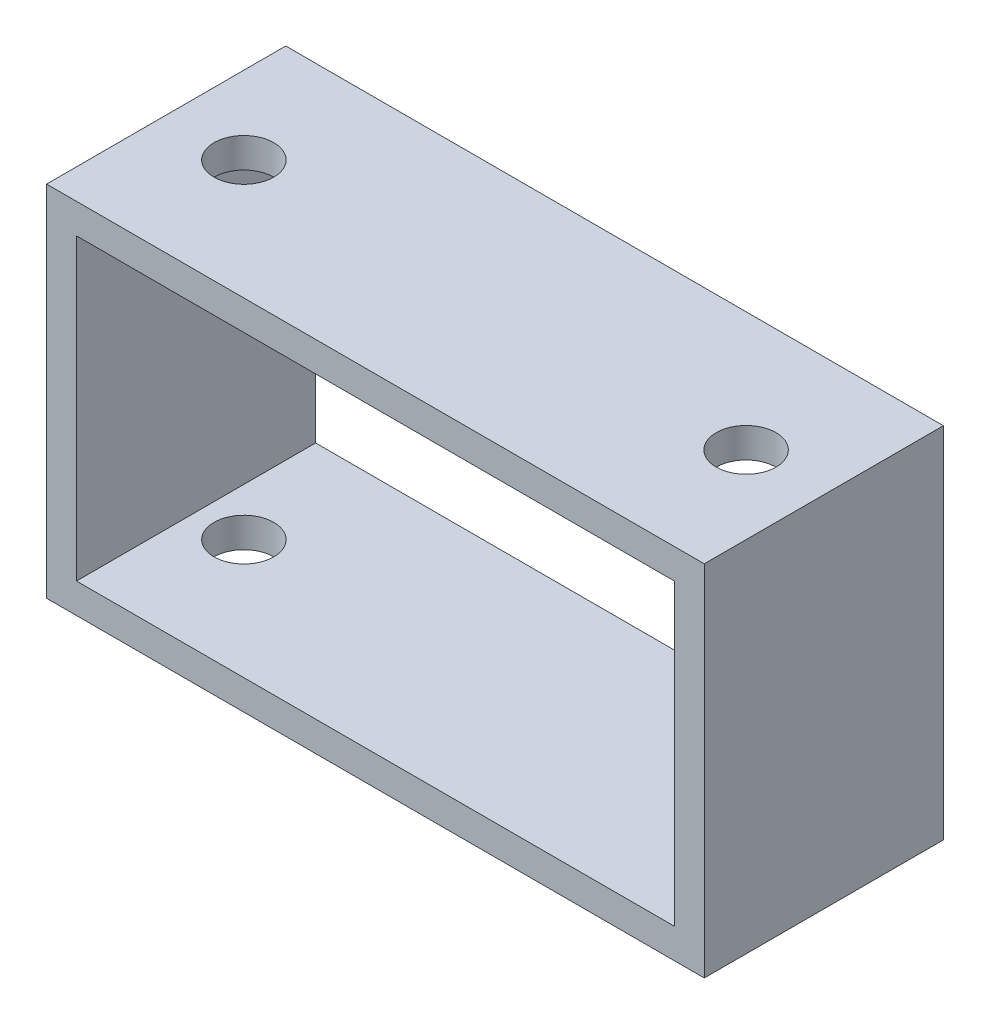
ISO-10303-21;
HEADER;
FILE_DESCRIPTION(('STEP AP214'),'2;1');
FILE_NAME('part.step','',(''),(''),'','','');
FILE_SCHEMA(('AUTOMOTIVE_DESIGN { 1 0 10303 214 1 1 1 1 }'));
ENDSEC;
DATA;
#1=APPLICATION_CONTEXT('core data for automotive mechanical design processes');
#2=APPLICATION_PROTOCOL_DEFINITION('international standard','automotive_design',2000,#1);
#3=PRODUCT_CONTEXT('',#1,'mechanical');
#4=PRODUCT('Part','Part','',(#3));
#5=PRODUCT_RELATED_PRODUCT_CATEGORY('part','',(#4));
#6=PRODUCT_DEFINITION_FORMATION('','',#4);
#7=PRODUCT_DEFINITION_CONTEXT('part definition',#1,'design');
#8=PRODUCT_DEFINITION('design','',#6,#7);
#9=PRODUCT_DEFINITION_SHAPE('','',#8);
#10=(LENGTH_UNIT() NAMED_UNIT(*) SI_UNIT(.MILLI.,.METRE.));
#11=(NAMED_UNIT(*) PLANE_ANGLE_UNIT() SI_UNIT($,.RADIAN.));
#12=(NAMED_UNIT(*) SI_UNIT($,.STERADIAN.) SOLID_ANGLE_UNIT());
#13=UNCERTAINTY_MEASURE_WITH_UNIT(LENGTH_MEASURE(1.E-05),#10,'distance_accuracy_value','');
#14=(GEOMETRIC_REPRESENTATION_CONTEXT(3) GLOBAL_UNCERTAINTY_ASSIGNED_CONTEXT((#13)) GLOBAL_UNIT_ASSIGNED_CONTEXT((#10,
#11,#12)) REPRESENTATION_CONTEXT('',''));
#15=CARTESIAN_POINT('',(0.,0.,0.));
#16=DIRECTION('',(0.,0.,1.));
#17=DIRECTION('',(1.,0.,0.));
#18=AXIS2_PLACEMENT_3D('',#15,#16,#17);
#19=CARTESIAN_POINT('',(27.5,30.,10.));
#20=DIRECTION('',(-1.,0.,0.));
#21=DIRECTION('',(0.,0.,1.));
#22=AXIS2_PLACEMENT_3D('',#19,#20,#21);
#23=PLANE('',#22);
#24=DIRECTION('',(0.,0.,-1.));
#25=VECTOR('',#24,1.);
#26=CARTESIAN_POINT('',(27.5,0.,10.));
#27=LINE('',#26,#25);
#28=CARTESIAN_POINT('',(27.5,0.,10.));
#29=VERTEX_POINT('',#28);
#30=CARTESIAN_POINT('',(27.5,0.,-10.));
#31=VERTEX_POINT('',#30);
#32=EDGE_CURVE('E119',#29,#31,#27,.T.);
#33=ORIENTED_EDGE('',*,*,#32,.T.);
#34=DIRECTION('',(0.,-1.,0.));
#35=VECTOR('',#34,1.);
#36=CARTESIAN_POINT('',(27.5,30.,-10.));
#37=LINE('',#36,#35);
#38=CARTESIAN_POINT('',(27.5,30.,-10.));
#39=VERTEX_POINT('',#38);
#40=EDGE_CURVE('E11',#39,#31,#37,.T.);
#41=ORIENTED_EDGE('',*,*,#40,.F.);
#42=DIRECTION('',(0.,0.,-1.));
#43=VECTOR('',#42,1.);
#44=CARTESIAN_POINT('',(27.5,30.,10.));
#45=LINE('',#44,#43);
#46=CARTESIAN_POINT('',(27.5,30.,10.));
#47=VERTEX_POINT('',#46);
#48=EDGE_CURVE('E142',#47,#39,#45,.T.);
#49=ORIENTED_EDGE('',*,*,#48,.F.);
#50=DIRECTION('',(0.,-1.,0.));
#51=VECTOR('',#50,1.);
#52=CARTESIAN_POINT('',(27.5,30.,10.));
#53=LINE('',#52,#51);
#54=EDGE_CURVE('E152',#47,#29,#53,.T.);
#55=ORIENTED_EDGE('',*,*,#54,.T.);
#56=EDGE_LOOP('',(#33,#41,#49,#55));
#57=FACE_BOUND('',#56,.T.);
#58=ADVANCED_FACE('F39',(#57),#23,.F.);
#59=CARTESIAN_POINT('',(-27.5,30.,-10.));
#60=DIRECTION('',(0.,0.,1.));
#61=DIRECTION('',(1.,0.,0.));
#62=AXIS2_PLACEMENT_3D('',#59,#60,#61);
#63=PLANE('',#62);
#64=DIRECTION('',(-1.,0.,0.));
#65=VECTOR('',#64,1.);
#66=CARTESIAN_POINT('',(-25.,2.5,-10.));
#67=LINE('',#66,#65);
#68=CARTESIAN_POINT('',(25.,2.5,-10.));
#69=VERTEX_POINT('',#68);
#70=CARTESIAN_POINT('',(-25.,2.5,-10.));
#71=VERTEX_POINT('',#70);
#72=EDGE_CURVE('E125',#69,#71,#67,.T.);
#73=ORIENTED_EDGE('',*,*,#72,.F.);
#74=DIRECTION('',(0.,-1.,0.));
#75=VECTOR('',#74,1.);
#76=CARTESIAN_POINT('',(25.,2.5,-10.));
#77=LINE('',#76,#75);
#78=CARTESIAN_POINT('',(25.,27.5,-10.));
#79=VERTEX_POINT('',#78);
#80=EDGE_CURVE('E107',#79,#69,#77,.T.);
#81=ORIENTED_EDGE('',*,*,#80,.F.);
#82=DIRECTION('',(1.,0.,0.));
#83=VECTOR('',#82,1.);
#84=CARTESIAN_POINT('',(-25.,27.5,-10.));
#85=LINE('',#84,#83);
#86=CARTESIAN_POINT('',(-25.,27.5,-10.));
#87=VERTEX_POINT('',#86);
#88=EDGE_CURVE('E116',#87,#79,#85,.T.);
#89=ORIENTED_EDGE('',*,*,#88,.F.);
#90=DIRECTION('',(0.,1.,0.));
#91=VECTOR('',#90,1.);
#92=CARTESIAN_POINT('',(-25.,2.5,-10.));
#93=LINE('',#92,#91);
#94=EDGE_CURVE('E55',#71,#87,#93,.T.);
#95=ORIENTED_EDGE('',*,*,#94,.F.);
#96=EDGE_LOOP('',(#73,#81,#89,#95));
#97=FACE_BOUND('',#96,.T.);
#98=DIRECTION('',(-1.,0.,0.));
#99=VECTOR('',#98,1.);
#100=CARTESIAN_POINT('',(-27.5,0.,-10.));
#101=LINE('',#100,#99);
#102=CARTESIAN_POINT('',(-27.5,0.,-10.));
#103=VERTEX_POINT('',#102);
#104=EDGE_CURVE('E155',#31,#103,#101,.T.);
#105=ORIENTED_EDGE('',*,*,#104,.T.);
#106=DIRECTION('',(0.,-1.,0.));
#107=VECTOR('',#106,1.);
#108=CARTESIAN_POINT('',(-27.5,30.,-10.));
#109=LINE('',#108,#107);
#110=CARTESIAN_POINT('',(-27.5,30.,-10.));
#111=VERTEX_POINT('',#110);
#112=EDGE_CURVE('E47',#111,#103,#109,.T.);
#113=ORIENTED_EDGE('',*,*,#112,.F.);
#114=DIRECTION('',(-1.,0.,0.));
#115=VECTOR('',#114,1.);
#116=CARTESIAN_POINT('',(-27.5,30.,-10.));
#117=LINE('',#116,#115);
#118=EDGE_CURVE('E145',#39,#111,#117,.T.);
#119=ORIENTED_EDGE('',*,*,#118,.F.);
#120=ORIENTED_EDGE('',*,*,#40,.T.);
#121=EDGE_LOOP('',(#105,#113,#119,#120));
#122=FACE_BOUND('',#121,.T.);
#123=ADVANCED_FACE('F122',(#97,#122),#63,.F.);
#124=CARTESIAN_POINT('',(-27.5,30.,10.));
#125=DIRECTION('',(1.,0.,0.));
#126=DIRECTION('',(0.,0.,-1.));
#127=AXIS2_PLACEMENT_3D('',#124,#125,#126);
#128=PLANE('',#127);
#129=DIRECTION('',(0.,0.,1.));
#130=VECTOR('',#129,1.);
#131=CARTESIAN_POINT('',(-27.5,0.,10.));
#132=LINE('',#131,#130);
#133=CARTESIAN_POINT('',(-27.5,0.,10.));
#134=VERTEX_POINT('',#133);
#135=EDGE_CURVE('E157',#103,#134,#132,.T.);
#136=ORIENTED_EDGE('',*,*,#135,.T.);
#137=DIRECTION('',(0.,-1.,0.));
#138=VECTOR('',#137,1.);
#139=CARTESIAN_POINT('',(-27.5,30.,10.));
#140=LINE('',#139,#138);
#141=CARTESIAN_POINT('',(-27.5,30.,10.));
#142=VERTEX_POINT('',#141);
#143=EDGE_CURVE('E162',#142,#134,#140,.T.);
#144=ORIENTED_EDGE('',*,*,#143,.F.);
#145=DIRECTION('',(0.,0.,1.));
#146=VECTOR('',#145,1.);
#147=CARTESIAN_POINT('',(-27.5,30.,10.));
#148=LINE('',#147,#146);
#149=EDGE_CURVE('E148',#111,#142,#148,.T.);
#150=ORIENTED_EDGE('',*,*,#149,.F.);
#151=ORIENTED_EDGE('',*,*,#112,.T.);
#152=EDGE_LOOP('',(#136,#144,#150,#151));
#153=FACE_BOUND('',#152,.T.);
#154=ADVANCED_FACE('F217',(#153),#128,.F.);
#155=CARTESIAN_POINT('',(-27.5,30.,10.));
#156=DIRECTION('',(0.,0.,-1.));
#157=DIRECTION('',(-1.,0.,0.));
#158=AXIS2_PLACEMENT_3D('',#155,#156,#157);
#159=PLANE('',#158);
#160=DIRECTION('',(-1.,0.,0.));
#161=VECTOR('',#160,1.);
#162=CARTESIAN_POINT('',(-25.,27.5,10.));
#163=LINE('',#162,#161);
#164=CARTESIAN_POINT('',(25.,27.5,10.));
#165=VERTEX_POINT('',#164);
#166=CARTESIAN_POINT('',(-25.,27.5,10.));
#167=VERTEX_POINT('',#166);
#168=EDGE_CURVE('E127',#165,#167,#163,.T.);
#169=ORIENTED_EDGE('',*,*,#168,.F.);
#170=DIRECTION('',(0.,1.,0.));
#171=VECTOR('',#170,1.);
#172=CARTESIAN_POINT('',(25.,2.5,10.));
#173=LINE('',#172,#171);
#174=CARTESIAN_POINT('',(25.,2.5,10.));
#175=VERTEX_POINT('',#174);
#176=EDGE_CURVE('E63',#175,#165,#173,.T.);
#177=ORIENTED_EDGE('',*,*,#176,.F.);
#178=DIRECTION('',(1.,0.,0.));
#179=VECTOR('',#178,1.);
#180=CARTESIAN_POINT('',(-25.,2.5,10.));
#181=LINE('',#180,#179);
#182=CARTESIAN_POINT('',(-25.,2.5,10.));
#183=VERTEX_POINT('',#182);
#184=EDGE_CURVE('E113',#183,#175,#181,.T.);
#185=ORIENTED_EDGE('',*,*,#184,.F.);
#186=DIRECTION('',(0.,-1.,0.));
#187=VECTOR('',#186,1.);
#188=CARTESIAN_POINT('',(-25.,2.5,10.));
#189=LINE('',#188,#187);
#190=EDGE_CURVE('E133',#167,#183,#189,.T.);
#191=ORIENTED_EDGE('',*,*,#190,.F.);
#192=EDGE_LOOP('',(#169,#177,#185,#191));
#193=FACE_BOUND('',#192,.T.);
#194=DIRECTION('',(1.,0.,0.));
#195=VECTOR('',#194,1.);
#196=CARTESIAN_POINT('',(-27.5,0.,10.));
#197=LINE('',#196,#195);
#198=EDGE_CURVE('E146',#134,#29,#197,.T.);
#199=ORIENTED_EDGE('',*,*,#198,.T.);
#200=ORIENTED_EDGE('',*,*,#54,.F.);
#201=DIRECTION('',(1.,0.,0.));
#202=VECTOR('',#201,1.);
#203=CARTESIAN_POINT('',(-27.5,30.,10.));
#204=LINE('',#203,#202);
#205=EDGE_CURVE('E150',#142,#47,#204,.T.);
#206=ORIENTED_EDGE('',*,*,#205,.F.);
#207=ORIENTED_EDGE('',*,*,#143,.T.);
#208=EDGE_LOOP('',(#199,#200,#206,#207));
#209=FACE_BOUND('',#208,.T.);
#210=ADVANCED_FACE('F233',(#193,#209),#159,.F.);
#211=CARTESIAN_POINT('',(0.,30.,0.));
#212=DIRECTION('',(0.,-1.,0.));
#213=DIRECTION('',(0.,0.,-1.));
#214=AXIS2_PLACEMENT_3D('',#211,#212,#213);
#215=PLANE('',#214);
#216=CARTESIAN_POINT('',(-21.,30.,0.));
#217=DIRECTION('',(0.,1.,0.));
#218=DIRECTION('',(0.,0.,1.));
#219=AXIS2_PLACEMENT_3D('',#216,#217,#218);
#220=CIRCLE('',#219,2.5);
#221=CARTESIAN_POINT('',(-21.,30.,2.5));
#222=VERTEX_POINT('',#221);
#223=EDGE_CURVE('E175',#222,#222,#220,.T.);
#224=ORIENTED_EDGE('',*,*,#223,.F.);
#225=EDGE_LOOP('',(#224));
#226=FACE_BOUND('',#225,.T.);
#227=CARTESIAN_POINT('',(21.,30.,0.));
#228=DIRECTION('',(0.,1.,0.));
#229=DIRECTION('',(0.,0.,1.));
#230=AXIS2_PLACEMENT_3D('',#227,#228,#229);
#231=CIRCLE('',#230,2.5);
#232=CARTESIAN_POINT('',(21.,30.,2.5));
#233=VERTEX_POINT('',#232);
#234=EDGE_CURVE('E180',#233,#233,#231,.T.);
#235=ORIENTED_EDGE('',*,*,#234,.F.);
#236=EDGE_LOOP('',(#235));
#237=FACE_BOUND('',#236,.T.);
#238=ORIENTED_EDGE('',*,*,#48,.T.);
#239=ORIENTED_EDGE('',*,*,#118,.T.);
#240=ORIENTED_EDGE('',*,*,#149,.T.);
#241=ORIENTED_EDGE('',*,*,#205,.T.);
#242=EDGE_LOOP('',(#238,#239,#240,#241));
#243=FACE_BOUND('',#242,.T.);
#244=ADVANCED_FACE('F229',(#226,#237,#243),#215,.F.);
#245=CARTESIAN_POINT('',(0.,0.,0.));
#246=DIRECTION('',(0.,-1.,0.));
#247=DIRECTION('',(0.,0.,-1.));
#248=AXIS2_PLACEMENT_3D('',#245,#246,#247);
#249=PLANE('',#248);
#250=CARTESIAN_POINT('',(-21.,0.,0.));
#251=DIRECTION('',(0.,-1.,0.));
#252=DIRECTION('',(0.,0.,-1.));
#253=AXIS2_PLACEMENT_3D('',#250,#251,#252);
#254=CIRCLE('',#253,2.5);
#255=CARTESIAN_POINT('',(-21.,0.,-2.5));
#256=VERTEX_POINT('',#255);
#257=EDGE_CURVE('E169',#256,#256,#254,.F.);
#258=ORIENTED_EDGE('',*,*,#257,.T.);
#259=EDGE_LOOP('',(#258));
#260=FACE_BOUND('',#259,.T.);
#261=CARTESIAN_POINT('',(21.,0.,0.));
#262=DIRECTION('',(0.,-1.,0.));
#263=DIRECTION('',(0.,0.,-1.));
#264=AXIS2_PLACEMENT_3D('',#261,#262,#263);
#265=CIRCLE('',#264,2.5);
#266=CARTESIAN_POINT('',(21.,0.,-2.5));
#267=VERTEX_POINT('',#266);
#268=EDGE_CURVE('E183',#267,#267,#265,.F.);
#269=ORIENTED_EDGE('',*,*,#268,.T.);
#270=EDGE_LOOP('',(#269));
#271=FACE_BOUND('',#270,.T.);
#272=ORIENTED_EDGE('',*,*,#32,.F.);
#273=ORIENTED_EDGE('',*,*,#198,.F.);
#274=ORIENTED_EDGE('',*,*,#135,.F.);
#275=ORIENTED_EDGE('',*,*,#104,.F.);
#276=EDGE_LOOP('',(#272,#273,#274,#275));
#277=FACE_BOUND('',#276,.T.);
#278=ADVANCED_FACE('F224',(#260,#271,#277),#249,.T.);
#279=CARTESIAN_POINT('',(25.,2.5,-10.001));
#280=DIRECTION('',(1.,0.,0.));
#281=DIRECTION('',(0.,0.,-1.));
#282=AXIS2_PLACEMENT_3D('',#279,#280,#281);
#283=PLANE('',#282);
#284=ORIENTED_EDGE('',*,*,#80,.T.);
#285=DIRECTION('',(0.,0.,1.));
#286=VECTOR('',#285,1.);
#287=CARTESIAN_POINT('',(25.,2.5,-10.001));
#288=LINE('',#287,#286);
#289=EDGE_CURVE('E120',#69,#175,#288,.T.);
#290=ORIENTED_EDGE('',*,*,#289,.T.);
#291=ORIENTED_EDGE('',*,*,#176,.T.);
#292=DIRECTION('',(0.,0.,1.));
#293=VECTOR('',#292,1.);
#294=CARTESIAN_POINT('',(25.,27.5,-10.001));
#295=LINE('',#294,#293);
#296=EDGE_CURVE('E103',#79,#165,#295,.T.);
#297=ORIENTED_EDGE('',*,*,#296,.F.);
#298=EDGE_LOOP('',(#284,#290,#291,#297));
#299=FACE_BOUND('',#298,.T.);
#300=ADVANCED_FACE('F105',(#299),#283,.F.);
#301=CARTESIAN_POINT('',(-25.,2.5,-10.001));
#302=DIRECTION('',(0.,-1.,0.));
#303=DIRECTION('',(0.,0.,-1.));
#304=AXIS2_PLACEMENT_3D('',#301,#302,#303);
#305=PLANE('',#304);
#306=CARTESIAN_POINT('',(-21.,2.5,0.));
#307=DIRECTION('',(0.,-1.,0.));
#308=DIRECTION('',(0.,0.,-1.));
#309=AXIS2_PLACEMENT_3D('',#306,#307,#308);
#310=CIRCLE('',#309,2.5);
#311=CARTESIAN_POINT('',(-21.,2.5,-2.5));
#312=VERTEX_POINT('',#311);
#313=EDGE_CURVE('E188',#312,#312,#310,.T.);
#314=ORIENTED_EDGE('',*,*,#313,.T.);
#315=EDGE_LOOP('',(#314));
#316=FACE_BOUND('',#315,.T.);
#317=CARTESIAN_POINT('',(21.,2.5,0.));
#318=DIRECTION('',(0.,-1.,0.));
#319=DIRECTION('',(0.,0.,-1.));
#320=AXIS2_PLACEMENT_3D('',#317,#318,#319);
#321=CIRCLE('',#320,2.5);
#322=CARTESIAN_POINT('',(21.,2.5,-2.5));
#323=VERTEX_POINT('',#322);
#324=EDGE_CURVE('E168',#323,#323,#321,.T.);
#325=ORIENTED_EDGE('',*,*,#324,.T.);
#326=EDGE_LOOP('',(#325));
#327=FACE_BOUND('',#326,.T.);
#328=ORIENTED_EDGE('',*,*,#72,.T.);
#329=DIRECTION('',(0.,0.,1.));
#330=VECTOR('',#329,1.);
#331=CARTESIAN_POINT('',(-25.,2.5,-10.001));
#332=LINE('',#331,#330);
#333=EDGE_CURVE('E139',#71,#183,#332,.T.);
#334=ORIENTED_EDGE('',*,*,#333,.T.);
#335=ORIENTED_EDGE('',*,*,#184,.T.);
#336=ORIENTED_EDGE('',*,*,#289,.F.);
#337=EDGE_LOOP('',(#328,#334,#335,#336));
#338=FACE_BOUND('',#337,.T.);
#339=ADVANCED_FACE('F250',(#316,#327,#338),#305,.F.);
#340=CARTESIAN_POINT('',(-25.,2.5,-10.001));
#341=DIRECTION('',(-1.,0.,0.));
#342=DIRECTION('',(0.,0.,1.));
#343=AXIS2_PLACEMENT_3D('',#340,#341,#342);
#344=PLANE('',#343);
#345=ORIENTED_EDGE('',*,*,#94,.T.);
#346=DIRECTION('',(0.,0.,1.));
#347=VECTOR('',#346,1.);
#348=CARTESIAN_POINT('',(-25.,27.5,-10.001));
#349=LINE('',#348,#347);
#350=EDGE_CURVE('E112',#87,#167,#349,.T.);
#351=ORIENTED_EDGE('',*,*,#350,.T.);
#352=ORIENTED_EDGE('',*,*,#190,.T.);
#353=ORIENTED_EDGE('',*,*,#333,.F.);
#354=EDGE_LOOP('',(#345,#351,#352,#353));
#355=FACE_BOUND('',#354,.T.);
#356=ADVANCED_FACE('F253',(#355),#344,.F.);
#357=CARTESIAN_POINT('',(-25.,27.5,-10.001));
#358=DIRECTION('',(0.,1.,0.));
#359=DIRECTION('',(0.,0.,1.));
#360=AXIS2_PLACEMENT_3D('',#357,#358,#359);
#361=PLANE('',#360);
#362=CARTESIAN_POINT('',(-21.,27.5,0.));
#363=DIRECTION('',(0.,1.,0.));
#364=DIRECTION('',(0.,0.,1.));
#365=AXIS2_PLACEMENT_3D('',#362,#363,#364);
#366=CIRCLE('',#365,2.5);
#367=CARTESIAN_POINT('',(-21.,27.5,2.5));
#368=VERTEX_POINT('',#367);
#369=EDGE_CURVE('E42',#368,#368,#366,.T.);
#370=ORIENTED_EDGE('',*,*,#369,.T.);
#371=EDGE_LOOP('',(#370));
#372=FACE_BOUND('',#371,.T.);
#373=CARTESIAN_POINT('',(21.,27.5,0.));
#374=DIRECTION('',(0.,1.,0.));
#375=DIRECTION('',(0.,0.,1.));
#376=AXIS2_PLACEMENT_3D('',#373,#374,#375);
#377=CIRCLE('',#376,2.5);
#378=CARTESIAN_POINT('',(21.,27.5,2.5));
#379=VERTEX_POINT('',#378);
#380=EDGE_CURVE('E166',#379,#379,#377,.T.);
#381=ORIENTED_EDGE('',*,*,#380,.T.);
#382=EDGE_LOOP('',(#381));
#383=FACE_BOUND('',#382,.T.);
#384=ORIENTED_EDGE('',*,*,#88,.T.);
#385=ORIENTED_EDGE('',*,*,#296,.T.);
#386=ORIENTED_EDGE('',*,*,#168,.T.);
#387=ORIENTED_EDGE('',*,*,#350,.F.);
#388=EDGE_LOOP('',(#384,#385,#386,#387));
#389=FACE_BOUND('',#388,.T.);
#390=ADVANCED_FACE('F117',(#372,#383,#389),#361,.F.);
#391=CARTESIAN_POINT('',(21.,-7.07106781186548,0.));
#392=DIRECTION('',(0.,1.,0.));
#393=DIRECTION('',(0.,0.,1.));
#394=AXIS2_PLACEMENT_3D('',#391,#392,#393);
#395=CYLINDRICAL_SURFACE('',#394,2.5);
#396=ORIENTED_EDGE('',*,*,#234,.T.);
#397=EDGE_LOOP('',(#396));
#398=FACE_BOUND('',#397,.T.);
#399=ORIENTED_EDGE('',*,*,#380,.F.);
#400=EDGE_LOOP('',(#399));
#401=FACE_BOUND('',#400,.T.);
#402=ADVANCED_FACE('F199',(#398,#401),#395,.F.);
#403=CARTESIAN_POINT('',(-21.,-7.07106781186548,0.));
#404=DIRECTION('',(0.,1.,0.));
#405=DIRECTION('',(0.,0.,1.));
#406=AXIS2_PLACEMENT_3D('',#403,#404,#405);
#407=CYLINDRICAL_SURFACE('',#406,2.5);
#408=ORIENTED_EDGE('',*,*,#223,.T.);
#409=EDGE_LOOP('',(#408));
#410=FACE_BOUND('',#409,.T.);
#411=ORIENTED_EDGE('',*,*,#369,.F.);
#412=EDGE_LOOP('',(#411));
#413=FACE_BOUND('',#412,.T.);
#414=ADVANCED_FACE('F196',(#410,#413),#407,.F.);
#415=ORIENTED_EDGE('',*,*,#268,.F.);
#416=EDGE_LOOP('',(#415));
#417=FACE_BOUND('',#416,.T.);
#418=ORIENTED_EDGE('',*,*,#324,.F.);
#419=EDGE_LOOP('',(#418));
#420=FACE_BOUND('',#419,.T.);
#421=ADVANCED_FACE('F198',(#417,#420),#395,.F.);
#422=ORIENTED_EDGE('',*,*,#257,.F.);
#423=EDGE_LOOP('',(#422));
#424=FACE_BOUND('',#423,.T.);
#425=ORIENTED_EDGE('',*,*,#313,.F.);
#426=EDGE_LOOP('',(#425));
#427=FACE_BOUND('',#426,.T.);
#428=ADVANCED_FACE('F202',(#424,#427),#407,.F.);
#429=CLOSED_SHELL('',(#58,#123,#154,#210,#244,#278,#300,#339,#356,#390,#402,#414,#421,#428));
#430=MANIFOLD_SOLID_BREP('B2',#429);
#431=ADVANCED_BREP_SHAPE_REPRESENTATION('',(#18,#430),#14);
#432=SHAPE_DEFINITION_REPRESENTATION(#9,#431);
ENDSEC;
END-ISO-10303-21;
